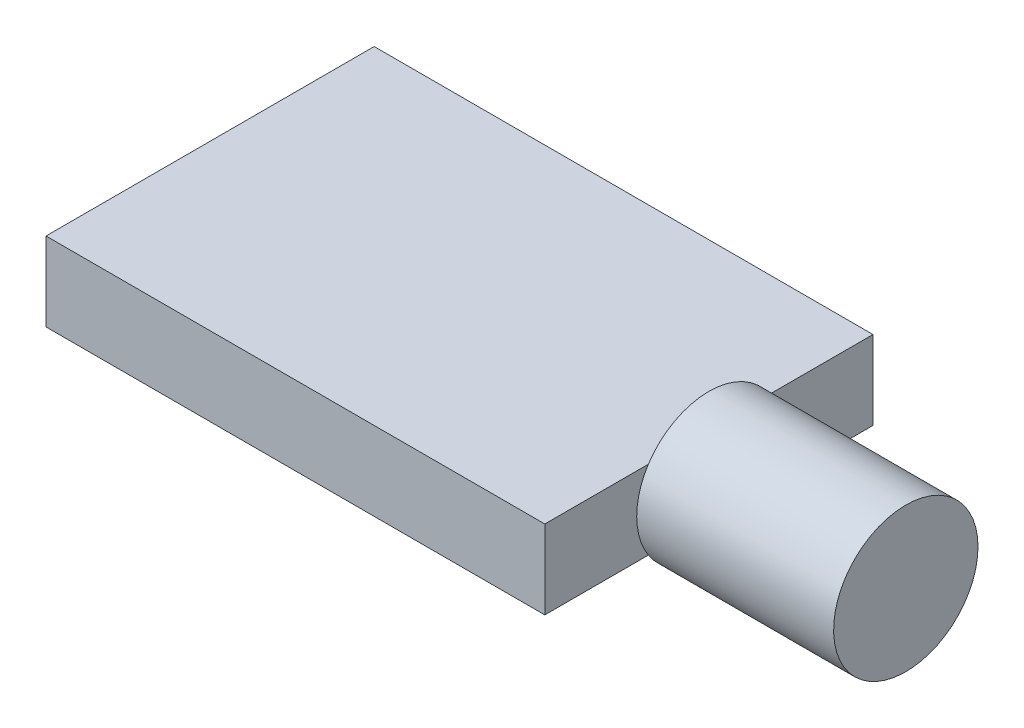
ISO-10303-21;
HEADER;
FILE_DESCRIPTION(('STEP AP214'),'2;1');
FILE_NAME('part.step','',(''),(''),'','','');
FILE_SCHEMA(('AUTOMOTIVE_DESIGN { 1 0 10303 214 1 1 1 1 }'));
ENDSEC;
DATA;
#1=APPLICATION_CONTEXT('core data for automotive mechanical design processes');
#2=APPLICATION_PROTOCOL_DEFINITION('international standard','automotive_design',2000,#1);
#3=PRODUCT_CONTEXT('',#1,'mechanical');
#4=PRODUCT('Part','Part','',(#3));
#5=PRODUCT_RELATED_PRODUCT_CATEGORY('part','',(#4));
#6=PRODUCT_DEFINITION_FORMATION('','',#4);
#7=PRODUCT_DEFINITION_CONTEXT('part definition',#1,'design');
#8=PRODUCT_DEFINITION('design','',#6,#7);
#9=PRODUCT_DEFINITION_SHAPE('','',#8);
#10=(LENGTH_UNIT() NAMED_UNIT(*) SI_UNIT(.MILLI.,.METRE.));
#11=(NAMED_UNIT(*) PLANE_ANGLE_UNIT() SI_UNIT($,.RADIAN.));
#12=(NAMED_UNIT(*) SI_UNIT($,.STERADIAN.) SOLID_ANGLE_UNIT());
#13=UNCERTAINTY_MEASURE_WITH_UNIT(LENGTH_MEASURE(1.E-05),#10,'distance_accuracy_value','');
#14=(GEOMETRIC_REPRESENTATION_CONTEXT(3) GLOBAL_UNCERTAINTY_ASSIGNED_CONTEXT((#13)) GLOBAL_UNIT_ASSIGNED_CONTEXT((#10,
#11,#12)) REPRESENTATION_CONTEXT('',''));
#15=CARTESIAN_POINT('',(0.,0.,0.));
#16=DIRECTION('',(0.,0.,1.));
#17=DIRECTION('',(1.,0.,0.));
#18=AXIS2_PLACEMENT_3D('',#15,#16,#17);
#19=CARTESIAN_POINT('',(19.,6.,12.5));
#20=DIRECTION('',(-1.,0.,0.));
#21=DIRECTION('',(0.,0.,1.));
#22=AXIS2_PLACEMENT_3D('',#19,#20,#21);
#23=PLANE('',#22);
#24=CARTESIAN_POINT('',(19.,3.,0.));
#25=DIRECTION('',(1.,0.,0.));
#26=DIRECTION('',(0.,0.,-1.));
#27=AXIS2_PLACEMENT_3D('',#24,#25,#26);
#28=CIRCLE('',#27,5.5);
#29=CARTESIAN_POINT('',(19.,6.,4.60977222864644));
#30=VERTEX_POINT('',#29);
#31=CARTESIAN_POINT('',(19.,0.,4.60977222864644));
#32=VERTEX_POINT('',#31);
#33=EDGE_CURVE('E11',#30,#32,#28,.T.);
#34=ORIENTED_EDGE('',*,*,#33,.F.);
#35=DIRECTION('',(0.,0.,-1.));
#36=VECTOR('',#35,1.);
#37=CARTESIAN_POINT('',(19.,6.,12.5));
#38=LINE('',#37,#36);
#39=CARTESIAN_POINT('',(19.,6.,12.5));
#40=VERTEX_POINT('',#39);
#41=EDGE_CURVE('E92',#40,#30,#38,.T.);
#42=ORIENTED_EDGE('',*,*,#41,.F.);
#43=DIRECTION('',(0.,-1.,0.));
#44=VECTOR('',#43,1.);
#45=CARTESIAN_POINT('',(19.,6.,12.5));
#46=LINE('',#45,#44);
#47=CARTESIAN_POINT('',(19.,0.,12.5));
#48=VERTEX_POINT('',#47);
#49=EDGE_CURVE('E117',#40,#48,#46,.T.);
#50=ORIENTED_EDGE('',*,*,#49,.T.);
#51=DIRECTION('',(0.,0.,-1.));
#52=VECTOR('',#51,1.);
#53=CARTESIAN_POINT('',(19.,0.,12.5));
#54=LINE('',#53,#52);
#55=EDGE_CURVE('E118',#48,#32,#54,.T.);
#56=ORIENTED_EDGE('',*,*,#55,.T.);
#57=EDGE_LOOP('',(#34,#42,#50,#56));
#58=FACE_BOUND('',#57,.T.);
#59=ADVANCED_FACE('F33',(#58),#23,.F.);
#60=CARTESIAN_POINT('',(19.,0.,-4.60977222864644));
#61=VERTEX_POINT('',#60);
#62=CARTESIAN_POINT('',(19.,6.,-4.60977222864644));
#63=VERTEX_POINT('',#62);
#64=EDGE_CURVE('E42',#61,#63,#28,.T.);
#65=ORIENTED_EDGE('',*,*,#64,.F.);
#66=CARTESIAN_POINT('',(19.,0.,-12.5));
#67=VERTEX_POINT('',#66);
#68=EDGE_CURVE('E108',#61,#67,#54,.T.);
#69=ORIENTED_EDGE('',*,*,#68,.T.);
#70=DIRECTION('',(0.,-1.,0.));
#71=VECTOR('',#70,1.);
#72=CARTESIAN_POINT('',(19.,6.,-12.5));
#73=LINE('',#72,#71);
#74=CARTESIAN_POINT('',(19.,6.,-12.5));
#75=VERTEX_POINT('',#74);
#76=EDGE_CURVE('E37',#75,#67,#73,.T.);
#77=ORIENTED_EDGE('',*,*,#76,.F.);
#78=EDGE_CURVE('E90',#63,#75,#38,.T.);
#79=ORIENTED_EDGE('',*,*,#78,.F.);
#80=EDGE_LOOP('',(#65,#69,#77,#79));
#81=FACE_BOUND('',#80,.T.);
#82=ADVANCED_FACE('F35',(#81),#23,.F.);
#83=CARTESIAN_POINT('',(-19.,6.,-12.5));
#84=DIRECTION('',(0.,0.,1.));
#85=DIRECTION('',(1.,0.,0.));
#86=AXIS2_PLACEMENT_3D('',#83,#84,#85);
#87=PLANE('',#86);
#88=DIRECTION('',(-1.,0.,0.));
#89=VECTOR('',#88,1.);
#90=CARTESIAN_POINT('',(-19.,0.,-12.5));
#91=LINE('',#90,#89);
#92=CARTESIAN_POINT('',(-19.,0.,-12.5));
#93=VERTEX_POINT('',#92);
#94=EDGE_CURVE('E120',#67,#93,#91,.T.);
#95=ORIENTED_EDGE('',*,*,#94,.T.);
#96=DIRECTION('',(0.,-1.,0.));
#97=VECTOR('',#96,1.);
#98=CARTESIAN_POINT('',(-19.,6.,-12.5));
#99=LINE('',#98,#97);
#100=CARTESIAN_POINT('',(-19.,6.,-12.5));
#101=VERTEX_POINT('',#100);
#102=EDGE_CURVE('E130',#101,#93,#99,.T.);
#103=ORIENTED_EDGE('',*,*,#102,.F.);
#104=DIRECTION('',(-1.,0.,0.));
#105=VECTOR('',#104,1.);
#106=CARTESIAN_POINT('',(-19.,6.,-12.5));
#107=LINE('',#106,#105);
#108=EDGE_CURVE('E111',#75,#101,#107,.T.);
#109=ORIENTED_EDGE('',*,*,#108,.F.);
#110=ORIENTED_EDGE('',*,*,#76,.T.);
#111=EDGE_LOOP('',(#95,#103,#109,#110));
#112=FACE_BOUND('',#111,.T.);
#113=ADVANCED_FACE('F137',(#112),#87,.F.);
#114=CARTESIAN_POINT('',(-19.,6.,12.5));
#115=DIRECTION('',(1.,0.,0.));
#116=DIRECTION('',(0.,0.,-1.));
#117=AXIS2_PLACEMENT_3D('',#114,#115,#116);
#118=PLANE('',#117);
#119=DIRECTION('',(0.,0.,1.));
#120=VECTOR('',#119,1.);
#121=CARTESIAN_POINT('',(-19.,0.,12.5));
#122=LINE('',#121,#120);
#123=CARTESIAN_POINT('',(-19.,0.,12.5));
#124=VERTEX_POINT('',#123);
#125=EDGE_CURVE('E123',#93,#124,#122,.T.);
#126=ORIENTED_EDGE('',*,*,#125,.T.);
#127=DIRECTION('',(0.,-1.,0.));
#128=VECTOR('',#127,1.);
#129=CARTESIAN_POINT('',(-19.,6.,12.5));
#130=LINE('',#129,#128);
#131=CARTESIAN_POINT('',(-19.,6.,12.5));
#132=VERTEX_POINT('',#131);
#133=EDGE_CURVE('E128',#132,#124,#130,.T.);
#134=ORIENTED_EDGE('',*,*,#133,.F.);
#135=DIRECTION('',(0.,0.,1.));
#136=VECTOR('',#135,1.);
#137=CARTESIAN_POINT('',(-19.,6.,12.5));
#138=LINE('',#137,#136);
#139=EDGE_CURVE('E113',#101,#132,#138,.T.);
#140=ORIENTED_EDGE('',*,*,#139,.F.);
#141=ORIENTED_EDGE('',*,*,#102,.T.);
#142=EDGE_LOOP('',(#126,#134,#140,#141));
#143=FACE_BOUND('',#142,.T.);
#144=ADVANCED_FACE('F142',(#143),#118,.F.);
#145=CARTESIAN_POINT('',(-19.,6.,12.5));
#146=DIRECTION('',(0.,0.,-1.));
#147=DIRECTION('',(-1.,0.,0.));
#148=AXIS2_PLACEMENT_3D('',#145,#146,#147);
#149=PLANE('',#148);
#150=DIRECTION('',(1.,0.,0.));
#151=VECTOR('',#150,1.);
#152=CARTESIAN_POINT('',(-19.,0.,12.5));
#153=LINE('',#152,#151);
#154=EDGE_CURVE('E99',#124,#48,#153,.T.);
#155=ORIENTED_EDGE('',*,*,#154,.T.);
#156=ORIENTED_EDGE('',*,*,#49,.F.);
#157=DIRECTION('',(1.,0.,0.));
#158=VECTOR('',#157,1.);
#159=CARTESIAN_POINT('',(-19.,6.,12.5));
#160=LINE('',#159,#158);
#161=EDGE_CURVE('E115',#132,#40,#160,.T.);
#162=ORIENTED_EDGE('',*,*,#161,.F.);
#163=ORIENTED_EDGE('',*,*,#133,.T.);
#164=EDGE_LOOP('',(#155,#156,#162,#163));
#165=FACE_BOUND('',#164,.T.);
#166=ADVANCED_FACE('F145',(#165),#149,.F.);
#167=CARTESIAN_POINT('',(0.,6.,0.));
#168=DIRECTION('',(0.,-1.,0.));
#169=DIRECTION('',(0.,0.,-1.));
#170=AXIS2_PLACEMENT_3D('',#167,#168,#169);
#171=PLANE('',#170);
#172=ORIENTED_EDGE('',*,*,#41,.T.);
#173=EDGE_CURVE('E88',#30,#63,#38,.T.);
#174=ORIENTED_EDGE('',*,*,#173,.T.);
#175=ORIENTED_EDGE('',*,*,#78,.T.);
#176=ORIENTED_EDGE('',*,*,#108,.T.);
#177=ORIENTED_EDGE('',*,*,#139,.T.);
#178=ORIENTED_EDGE('',*,*,#161,.T.);
#179=EDGE_LOOP('',(#172,#174,#175,#176,#177,#178));
#180=FACE_BOUND('',#179,.T.);
#181=ADVANCED_FACE('F89',(#180),#171,.F.);
#182=CARTESIAN_POINT('',(0.,0.,0.));
#183=DIRECTION('',(0.,-1.,0.));
#184=DIRECTION('',(0.,0.,-1.));
#185=AXIS2_PLACEMENT_3D('',#182,#183,#184);
#186=PLANE('',#185);
#187=ORIENTED_EDGE('',*,*,#55,.F.);
#188=ORIENTED_EDGE('',*,*,#154,.F.);
#189=ORIENTED_EDGE('',*,*,#125,.F.);
#190=ORIENTED_EDGE('',*,*,#94,.F.);
#191=ORIENTED_EDGE('',*,*,#68,.F.);
#192=EDGE_CURVE('E121',#32,#61,#54,.T.);
#193=ORIENTED_EDGE('',*,*,#192,.F.);
#194=EDGE_LOOP('',(#187,#188,#189,#190,#191,#193));
#195=FACE_BOUND('',#194,.T.);
#196=ADVANCED_FACE('F161',(#195),#186,.T.);
#197=CARTESIAN_POINT('',(19.,3.,0.));
#198=DIRECTION('',(1.,0.,0.));
#199=DIRECTION('',(0.,0.,-1.));
#200=AXIS2_PLACEMENT_3D('',#197,#198,#199);
#201=PLANE('',#200);
#202=EDGE_CURVE('E44',#32,#61,#28,.T.);
#203=ORIENTED_EDGE('',*,*,#202,.F.);
#204=ORIENTED_EDGE('',*,*,#192,.T.);
#205=EDGE_LOOP('',(#203,#204));
#206=FACE_BOUND('',#205,.T.);
#207=ADVANCED_FACE('F164',(#206),#201,.F.);
#208=CARTESIAN_POINT('',(34.,3.,0.));
#209=DIRECTION('',(-1.,0.,0.));
#210=DIRECTION('',(0.,0.,1.));
#211=AXIS2_PLACEMENT_3D('',#208,#209,#210);
#212=CYLINDRICAL_SURFACE('',#211,5.5);
#213=CARTESIAN_POINT('',(34.,3.,0.));
#214=DIRECTION('',(1.,0.,0.));
#215=DIRECTION('',(0.,0.,-1.));
#216=AXIS2_PLACEMENT_3D('',#213,#214,#215);
#217=CIRCLE('',#216,5.5);
#218=CARTESIAN_POINT('',(34.,3.,-5.5));
#219=VERTEX_POINT('',#218);
#220=EDGE_CURVE('E106',#219,#219,#217,.T.);
#221=ORIENTED_EDGE('',*,*,#220,.F.);
#222=EDGE_LOOP('',(#221));
#223=FACE_BOUND('',#222,.T.);
#224=EDGE_CURVE('E103',#63,#30,#28,.T.);
#225=ORIENTED_EDGE('',*,*,#224,.T.);
#226=ORIENTED_EDGE('',*,*,#33,.T.);
#227=ORIENTED_EDGE('',*,*,#202,.T.);
#228=ORIENTED_EDGE('',*,*,#64,.T.);
#229=EDGE_LOOP('',(#225,#226,#227,#228));
#230=FACE_BOUND('',#229,.T.);
#231=ADVANCED_FACE('F102',(#223,#230),#212,.T.);
#232=CARTESIAN_POINT('',(34.,3.,0.));
#233=DIRECTION('',(1.,0.,0.));
#234=DIRECTION('',(0.,0.,-1.));
#235=AXIS2_PLACEMENT_3D('',#232,#233,#234);
#236=PLANE('',#235);
#237=ORIENTED_EDGE('',*,*,#220,.T.);
#238=EDGE_LOOP('',(#237));
#239=FACE_BOUND('',#238,.T.);
#240=ADVANCED_FACE('F170',(#239),#236,.T.);
#241=ORIENTED_EDGE('',*,*,#173,.F.);
#242=ORIENTED_EDGE('',*,*,#224,.F.);
#243=EDGE_LOOP('',(#241,#242));
#244=FACE_BOUND('',#243,.T.);
#245=ADVANCED_FACE('F105',(#244),#201,.F.);
#246=CLOSED_SHELL('',(#59,#82,#113,#144,#166,#181,#196,#207,#231,#240,#245));
#247=MANIFOLD_SOLID_BREP('B2',#246);
#248=ADVANCED_BREP_SHAPE_REPRESENTATION('',(#18,#247),#14);
#249=SHAPE_DEFINITION_REPRESENTATION(#9,#248);
ENDSEC;
END-ISO-10303-21;
